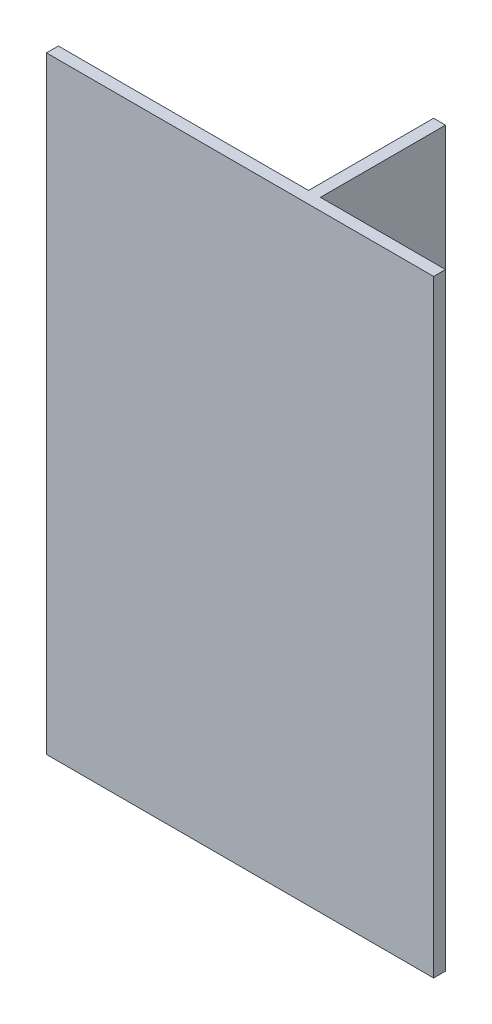
ISO-10303-21;
HEADER;
FILE_DESCRIPTION(('STEP AP214'),'2;1');
FILE_NAME('part.step','',(''),(''),'','','');
FILE_SCHEMA(('AUTOMOTIVE_DESIGN { 1 0 10303 214 1 1 1 1 }'));
ENDSEC;
DATA;
#1=APPLICATION_CONTEXT('core data for automotive mechanical design processes');
#2=APPLICATION_PROTOCOL_DEFINITION('international standard','automotive_design',2000,#1);
#3=PRODUCT_CONTEXT('',#1,'mechanical');
#4=PRODUCT('Part','Part','',(#3));
#5=PRODUCT_RELATED_PRODUCT_CATEGORY('part','',(#4));
#6=PRODUCT_DEFINITION_FORMATION('','',#4);
#7=PRODUCT_DEFINITION_CONTEXT('part definition',#1,'design');
#8=PRODUCT_DEFINITION('design','',#6,#7);
#9=PRODUCT_DEFINITION_SHAPE('','',#8);
#10=(LENGTH_UNIT() NAMED_UNIT(*) SI_UNIT(.MILLI.,.METRE.));
#11=(NAMED_UNIT(*) PLANE_ANGLE_UNIT() SI_UNIT($,.RADIAN.));
#12=(NAMED_UNIT(*) SI_UNIT($,.STERADIAN.) SOLID_ANGLE_UNIT());
#13=UNCERTAINTY_MEASURE_WITH_UNIT(LENGTH_MEASURE(1.E-05),#10,'distance_accuracy_value','');
#14=(GEOMETRIC_REPRESENTATION_CONTEXT(3) GLOBAL_UNCERTAINTY_ASSIGNED_CONTEXT((#13)) GLOBAL_UNIT_ASSIGNED_CONTEXT((#10,
#11,#12)) REPRESENTATION_CONTEXT('',''));
#15=CARTESIAN_POINT('',(0.,0.,0.));
#16=DIRECTION('',(0.,0.,1.));
#17=DIRECTION('',(1.,0.,0.));
#18=AXIS2_PLACEMENT_3D('',#15,#16,#17);
#19=CARTESIAN_POINT('',(0.,102.,-2.));
#20=DIRECTION('',(0.,0.,-1.));
#21=DIRECTION('',(-1.,0.,0.));
#22=AXIS2_PLACEMENT_3D('',#19,#20,#21);
#23=PLANE('',#22);
#24=DIRECTION('',(1.,0.,0.));
#25=VECTOR('',#24,1.);
#26=CARTESIAN_POINT('',(0.,0.,-2.));
#27=LINE('',#26,#25);
#28=CARTESIAN_POINT('',(0.,0.,-2.));
#29=VERTEX_POINT('',#28);
#30=CARTESIAN_POINT('',(42.,0.,-2.));
#31=VERTEX_POINT('',#30);
#32=EDGE_CURVE('E130',#29,#31,#27,.T.);
#33=ORIENTED_EDGE('',*,*,#32,.F.);
#34=DIRECTION('',(0.,-1.,0.));
#35=VECTOR('',#34,1.);
#36=CARTESIAN_POINT('',(0.,102.,-2.));
#37=LINE('',#36,#35);
#38=CARTESIAN_POINT('',(0.,102.,-2.));
#39=VERTEX_POINT('',#38);
#40=EDGE_CURVE('E11',#39,#29,#37,.T.);
#41=ORIENTED_EDGE('',*,*,#40,.F.);
#42=DIRECTION('',(1.,0.,0.));
#43=VECTOR('',#42,1.);
#44=CARTESIAN_POINT('',(0.,102.,-2.));
#45=LINE('',#44,#43);
#46=CARTESIAN_POINT('',(42.,102.,-2.));
#47=VERTEX_POINT('',#46);
#48=EDGE_CURVE('E150',#39,#47,#45,.T.);
#49=ORIENTED_EDGE('',*,*,#48,.T.);
#50=DIRECTION('',(0.,-1.,0.));
#51=VECTOR('',#50,1.);
#52=CARTESIAN_POINT('',(42.,102.,-2.));
#53=LINE('',#52,#51);
#54=EDGE_CURVE('E36',#47,#31,#53,.T.);
#55=ORIENTED_EDGE('',*,*,#54,.T.);
#56=EDGE_LOOP('',(#33,#41,#49,#55));
#57=FACE_BOUND('',#56,.T.);
#58=ADVANCED_FACE('F33',(#57),#23,.T.);
#59=CARTESIAN_POINT('',(0.,102.,0.));
#60=DIRECTION('',(-1.,0.,0.));
#61=DIRECTION('',(0.,0.,1.));
#62=AXIS2_PLACEMENT_3D('',#59,#60,#61);
#63=PLANE('',#62);
#64=DIRECTION('',(0.,0.,-1.));
#65=VECTOR('',#64,1.);
#66=CARTESIAN_POINT('',(0.,0.,0.));
#67=LINE('',#66,#65);
#68=CARTESIAN_POINT('',(0.,0.,0.));
#69=VERTEX_POINT('',#68);
#70=EDGE_CURVE('E148',#69,#29,#67,.T.);
#71=ORIENTED_EDGE('',*,*,#70,.F.);
#72=DIRECTION('',(0.,-1.,0.));
#73=VECTOR('',#72,1.);
#74=CARTESIAN_POINT('',(0.,102.,0.));
#75=LINE('',#74,#73);
#76=CARTESIAN_POINT('',(0.,102.,0.));
#77=VERTEX_POINT('',#76);
#78=EDGE_CURVE('E42',#77,#69,#75,.T.);
#79=ORIENTED_EDGE('',*,*,#78,.F.);
#80=DIRECTION('',(0.,0.,-1.));
#81=VECTOR('',#80,1.);
#82=CARTESIAN_POINT('',(0.,102.,0.));
#83=LINE('',#82,#81);
#84=EDGE_CURVE('E110',#77,#39,#83,.T.);
#85=ORIENTED_EDGE('',*,*,#84,.T.);
#86=ORIENTED_EDGE('',*,*,#40,.T.);
#87=EDGE_LOOP('',(#71,#79,#85,#86));
#88=FACE_BOUND('',#87,.T.);
#89=ADVANCED_FACE('F162',(#88),#63,.T.);
#90=CARTESIAN_POINT('',(0.,102.,0.));
#91=DIRECTION('',(0.,0.,-1.));
#92=DIRECTION('',(-1.,0.,0.));
#93=AXIS2_PLACEMENT_3D('',#90,#91,#92);
#94=PLANE('',#93);
#95=DIRECTION('',(1.,0.,0.));
#96=VECTOR('',#95,1.);
#97=CARTESIAN_POINT('',(0.,0.,0.));
#98=LINE('',#97,#96);
#99=CARTESIAN_POINT('',(65.,0.,0.));
#100=VERTEX_POINT('',#99);
#101=EDGE_CURVE('E115',#69,#100,#98,.T.);
#102=ORIENTED_EDGE('',*,*,#101,.T.);
#103=DIRECTION('',(0.,-1.,0.));
#104=VECTOR('',#103,1.);
#105=CARTESIAN_POINT('',(65.,102.,0.));
#106=LINE('',#105,#104);
#107=CARTESIAN_POINT('',(65.,102.,0.));
#108=VERTEX_POINT('',#107);
#109=EDGE_CURVE('E113',#108,#100,#106,.T.);
#110=ORIENTED_EDGE('',*,*,#109,.F.);
#111=DIRECTION('',(1.,0.,0.));
#112=VECTOR('',#111,1.);
#113=CARTESIAN_POINT('',(0.,102.,0.));
#114=LINE('',#113,#112);
#115=EDGE_CURVE('E103',#77,#108,#114,.T.);
#116=ORIENTED_EDGE('',*,*,#115,.F.);
#117=ORIENTED_EDGE('',*,*,#78,.T.);
#118=EDGE_LOOP('',(#102,#110,#116,#117));
#119=FACE_BOUND('',#118,.T.);
#120=ADVANCED_FACE('F114',(#119),#94,.F.);
#121=CARTESIAN_POINT('',(65.,102.,0.));
#122=DIRECTION('',(-1.,0.,0.));
#123=DIRECTION('',(0.,0.,1.));
#124=AXIS2_PLACEMENT_3D('',#121,#122,#123);
#125=PLANE('',#124);
#126=DIRECTION('',(0.,0.,-1.));
#127=VECTOR('',#126,1.);
#128=CARTESIAN_POINT('',(65.,0.,0.));
#129=LINE('',#128,#127);
#130=CARTESIAN_POINT('',(65.,0.,-2.));
#131=VERTEX_POINT('',#130);
#132=EDGE_CURVE('E145',#100,#131,#129,.T.);
#133=ORIENTED_EDGE('',*,*,#132,.T.);
#134=DIRECTION('',(0.,-1.,0.));
#135=VECTOR('',#134,1.);
#136=CARTESIAN_POINT('',(65.,102.,-2.));
#137=LINE('',#136,#135);
#138=CARTESIAN_POINT('',(65.,102.,-2.));
#139=VERTEX_POINT('',#138);
#140=EDGE_CURVE('E119',#139,#131,#137,.T.);
#141=ORIENTED_EDGE('',*,*,#140,.F.);
#142=DIRECTION('',(0.,0.,-1.));
#143=VECTOR('',#142,1.);
#144=CARTESIAN_POINT('',(65.,102.,0.));
#145=LINE('',#144,#143);
#146=EDGE_CURVE('E108',#108,#139,#145,.T.);
#147=ORIENTED_EDGE('',*,*,#146,.F.);
#148=ORIENTED_EDGE('',*,*,#109,.T.);
#149=EDGE_LOOP('',(#133,#141,#147,#148));
#150=FACE_BOUND('',#149,.T.);
#151=ADVANCED_FACE('F121',(#150),#125,.F.);
#152=CARTESIAN_POINT('',(44.,102.,-2.));
#153=DIRECTION('',(0.,0.,-1.));
#154=DIRECTION('',(-1.,0.,0.));
#155=AXIS2_PLACEMENT_3D('',#152,#153,#154);
#156=PLANE('',#155);
#157=DIRECTION('',(1.,0.,0.));
#158=VECTOR('',#157,1.);
#159=CARTESIAN_POINT('',(44.,0.,-2.));
#160=LINE('',#159,#158);
#161=CARTESIAN_POINT('',(44.,0.,-2.));
#162=VERTEX_POINT('',#161);
#163=EDGE_CURVE('E142',#162,#131,#160,.T.);
#164=ORIENTED_EDGE('',*,*,#163,.F.);
#165=DIRECTION('',(0.,-1.,0.));
#166=VECTOR('',#165,1.);
#167=CARTESIAN_POINT('',(44.,102.,-2.));
#168=LINE('',#167,#166);
#169=CARTESIAN_POINT('',(44.,102.,-2.));
#170=VERTEX_POINT('',#169);
#171=EDGE_CURVE('E154',#170,#162,#168,.T.);
#172=ORIENTED_EDGE('',*,*,#171,.F.);
#173=DIRECTION('',(1.,0.,0.));
#174=VECTOR('',#173,1.);
#175=CARTESIAN_POINT('',(44.,102.,-2.));
#176=LINE('',#175,#174);
#177=EDGE_CURVE('E123',#170,#139,#176,.T.);
#178=ORIENTED_EDGE('',*,*,#177,.T.);
#179=ORIENTED_EDGE('',*,*,#140,.T.);
#180=EDGE_LOOP('',(#164,#172,#178,#179));
#181=FACE_BOUND('',#180,.T.);
#182=ADVANCED_FACE('F175',(#181),#156,.T.);
#183=CARTESIAN_POINT('',(44.,102.,-2.));
#184=DIRECTION('',(-1.,0.,0.));
#185=DIRECTION('',(0.,0.,1.));
#186=AXIS2_PLACEMENT_3D('',#183,#184,#185);
#187=PLANE('',#186);
#188=DIRECTION('',(0.,0.,-1.));
#189=VECTOR('',#188,1.);
#190=CARTESIAN_POINT('',(44.,0.,-2.));
#191=LINE('',#190,#189);
#192=CARTESIAN_POINT('',(44.,0.,-23.));
#193=VERTEX_POINT('',#192);
#194=EDGE_CURVE('E139',#162,#193,#191,.T.);
#195=ORIENTED_EDGE('',*,*,#194,.T.);
#196=DIRECTION('',(0.,-1.,0.));
#197=VECTOR('',#196,1.);
#198=CARTESIAN_POINT('',(44.,102.,-23.));
#199=LINE('',#198,#197);
#200=CARTESIAN_POINT('',(44.,102.,-23.));
#201=VERTEX_POINT('',#200);
#202=EDGE_CURVE('E156',#201,#193,#199,.T.);
#203=ORIENTED_EDGE('',*,*,#202,.F.);
#204=DIRECTION('',(0.,0.,-1.));
#205=VECTOR('',#204,1.);
#206=CARTESIAN_POINT('',(44.,102.,-2.));
#207=LINE('',#206,#205);
#208=EDGE_CURVE('E125',#170,#201,#207,.T.);
#209=ORIENTED_EDGE('',*,*,#208,.F.);
#210=ORIENTED_EDGE('',*,*,#171,.T.);
#211=EDGE_LOOP('',(#195,#203,#209,#210));
#212=FACE_BOUND('',#211,.T.);
#213=ADVANCED_FACE('F178',(#212),#187,.F.);
#214=CARTESIAN_POINT('',(42.,102.,-23.));
#215=DIRECTION('',(0.,0.,-1.));
#216=DIRECTION('',(-1.,0.,0.));
#217=AXIS2_PLACEMENT_3D('',#214,#215,#216);
#218=PLANE('',#217);
#219=DIRECTION('',(1.,0.,0.));
#220=VECTOR('',#219,1.);
#221=CARTESIAN_POINT('',(42.,0.,-23.));
#222=LINE('',#221,#220);
#223=CARTESIAN_POINT('',(42.,0.,-23.));
#224=VERTEX_POINT('',#223);
#225=EDGE_CURVE('E136',#224,#193,#222,.T.);
#226=ORIENTED_EDGE('',*,*,#225,.F.);
#227=DIRECTION('',(0.,-1.,0.));
#228=VECTOR('',#227,1.);
#229=CARTESIAN_POINT('',(42.,102.,-23.));
#230=LINE('',#229,#228);
#231=CARTESIAN_POINT('',(42.,102.,-23.));
#232=VERTEX_POINT('',#231);
#233=EDGE_CURVE('E157',#232,#224,#230,.T.);
#234=ORIENTED_EDGE('',*,*,#233,.F.);
#235=DIRECTION('',(1.,0.,0.));
#236=VECTOR('',#235,1.);
#237=CARTESIAN_POINT('',(42.,102.,-23.));
#238=LINE('',#237,#236);
#239=EDGE_CURVE('E253',#232,#201,#238,.T.);
#240=ORIENTED_EDGE('',*,*,#239,.T.);
#241=ORIENTED_EDGE('',*,*,#202,.T.);
#242=EDGE_LOOP('',(#226,#234,#240,#241));
#243=FACE_BOUND('',#242,.T.);
#244=ADVANCED_FACE('F182',(#243),#218,.T.);
#245=CARTESIAN_POINT('',(42.,102.,-2.));
#246=DIRECTION('',(-1.,0.,0.));
#247=DIRECTION('',(0.,0.,1.));
#248=AXIS2_PLACEMENT_3D('',#245,#246,#247);
#249=PLANE('',#248);
#250=DIRECTION('',(0.,0.,-1.));
#251=VECTOR('',#250,1.);
#252=CARTESIAN_POINT('',(42.,0.,-2.));
#253=LINE('',#252,#251);
#254=EDGE_CURVE('E133',#31,#224,#253,.T.);
#255=ORIENTED_EDGE('',*,*,#254,.F.);
#256=ORIENTED_EDGE('',*,*,#54,.F.);
#257=DIRECTION('',(0.,0.,-1.));
#258=VECTOR('',#257,1.);
#259=CARTESIAN_POINT('',(42.,102.,-2.));
#260=LINE('',#259,#258);
#261=EDGE_CURVE('E254',#47,#232,#260,.T.);
#262=ORIENTED_EDGE('',*,*,#261,.T.);
#263=ORIENTED_EDGE('',*,*,#233,.T.);
#264=EDGE_LOOP('',(#255,#256,#262,#263));
#265=FACE_BOUND('',#264,.T.);
#266=ADVANCED_FACE('F159',(#265),#249,.T.);
#267=CARTESIAN_POINT('',(0.,102.,0.));
#268=DIRECTION('',(0.,1.,0.));
#269=DIRECTION('',(0.,0.,1.));
#270=AXIS2_PLACEMENT_3D('',#267,#268,#269);
#271=PLANE('',#270);
#272=ORIENTED_EDGE('',*,*,#48,.F.);
#273=ORIENTED_EDGE('',*,*,#84,.F.);
#274=ORIENTED_EDGE('',*,*,#115,.T.);
#275=ORIENTED_EDGE('',*,*,#146,.T.);
#276=ORIENTED_EDGE('',*,*,#177,.F.);
#277=ORIENTED_EDGE('',*,*,#208,.T.);
#278=ORIENTED_EDGE('',*,*,#239,.F.);
#279=ORIENTED_EDGE('',*,*,#261,.F.);
#280=EDGE_LOOP('',(#272,#273,#274,#275,#276,#277,#278,#279));
#281=FACE_BOUND('',#280,.T.);
#282=ADVANCED_FACE('F105',(#281),#271,.T.);
#283=CARTESIAN_POINT('',(0.,0.,0.));
#284=DIRECTION('',(0.,1.,0.));
#285=DIRECTION('',(0.,0.,1.));
#286=AXIS2_PLACEMENT_3D('',#283,#284,#285);
#287=PLANE('',#286);
#288=ORIENTED_EDGE('',*,*,#32,.T.);
#289=ORIENTED_EDGE('',*,*,#254,.T.);
#290=ORIENTED_EDGE('',*,*,#225,.T.);
#291=ORIENTED_EDGE('',*,*,#194,.F.);
#292=ORIENTED_EDGE('',*,*,#163,.T.);
#293=ORIENTED_EDGE('',*,*,#132,.F.);
#294=ORIENTED_EDGE('',*,*,#101,.F.);
#295=ORIENTED_EDGE('',*,*,#70,.T.);
#296=EDGE_LOOP('',(#288,#289,#290,#291,#292,#293,#294,#295));
#297=FACE_BOUND('',#296,.T.);
#298=ADVANCED_FACE('F161',(#297),#287,.F.);
#299=CLOSED_SHELL('',(#58,#89,#120,#151,#182,#213,#244,#266,#282,#298));
#300=MANIFOLD_SOLID_BREP('B2',#299);
#301=ADVANCED_BREP_SHAPE_REPRESENTATION('',(#18,#300),#14);
#302=SHAPE_DEFINITION_REPRESENTATION(#9,#301);
ENDSEC;
END-ISO-10303-21;
